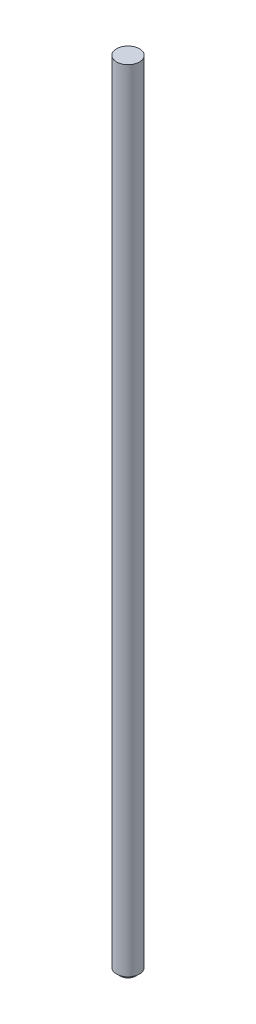
ISO-10303-21;
HEADER;
FILE_DESCRIPTION(('STEP AP214'),'2;1');
FILE_NAME('part.step','',(''),(''),'','','');
FILE_SCHEMA(('AUTOMOTIVE_DESIGN { 1 0 10303 214 1 1 1 1 }'));
ENDSEC;
DATA;
#1=APPLICATION_CONTEXT('core data for automotive mechanical design processes');
#2=APPLICATION_PROTOCOL_DEFINITION('international standard','automotive_design',2000,#1);
#3=PRODUCT_CONTEXT('',#1,'mechanical');
#4=PRODUCT('Part','Part','',(#3));
#5=PRODUCT_RELATED_PRODUCT_CATEGORY('part','',(#4));
#6=PRODUCT_DEFINITION_FORMATION('','',#4);
#7=PRODUCT_DEFINITION_CONTEXT('part definition',#1,'design');
#8=PRODUCT_DEFINITION('design','',#6,#7);
#9=PRODUCT_DEFINITION_SHAPE('','',#8);
#10=(LENGTH_UNIT() NAMED_UNIT(*) SI_UNIT(.MILLI.,.METRE.));
#11=(NAMED_UNIT(*) PLANE_ANGLE_UNIT() SI_UNIT($,.RADIAN.));
#12=(NAMED_UNIT(*) SI_UNIT($,.STERADIAN.) SOLID_ANGLE_UNIT());
#13=UNCERTAINTY_MEASURE_WITH_UNIT(LENGTH_MEASURE(1.E-05),#10,'distance_accuracy_value','');
#14=(GEOMETRIC_REPRESENTATION_CONTEXT(3) GLOBAL_UNCERTAINTY_ASSIGNED_CONTEXT((#13)) GLOBAL_UNIT_ASSIGNED_CONTEXT((#10,
#11,#12)) REPRESENTATION_CONTEXT('',''));
#15=CARTESIAN_POINT('',(0.,0.,0.));
#16=DIRECTION('',(0.,0.,1.));
#17=DIRECTION('',(1.,0.,0.));
#18=AXIS2_PLACEMENT_3D('',#15,#16,#17);
#19=CARTESIAN_POINT('',(0.,400.,0.));
#20=DIRECTION('',(0.,1.,0.));
#21=DIRECTION('',(0.,0.,1.));
#22=AXIS2_PLACEMENT_3D('',#19,#20,#21);
#23=PLANE('',#22);
#24=CARTESIAN_POINT('',(0.,400.,0.));
#25=DIRECTION('',(0.,-1.,0.));
#26=DIRECTION('',(0.,0.,-1.));
#27=AXIS2_PLACEMENT_3D('',#24,#25,#26);
#28=CIRCLE('',#27,5.775);
#29=CARTESIAN_POINT('',(0.,400.,-5.775));
#30=VERTEX_POINT('',#29);
#31=EDGE_CURVE('E10',#30,#30,#28,.T.);
#32=ORIENTED_EDGE('',*,*,#31,.F.);
#33=EDGE_LOOP('',(#32));
#34=FACE_BOUND('',#33,.T.);
#35=ADVANCED_FACE('F31',(#34),#23,.T.);
#36=CARTESIAN_POINT('',(0.,0.,0.));
#37=DIRECTION('',(0.,-1.,0.));
#38=DIRECTION('',(0.,0.,-1.));
#39=AXIS2_PLACEMENT_3D('',#36,#37,#38);
#40=CYLINDRICAL_SURFACE('',#39,5.775);
#41=ORIENTED_EDGE('',*,*,#31,.T.);
#42=EDGE_LOOP('',(#41));
#43=FACE_BOUND('',#42,.T.);
#44=CARTESIAN_POINT('',(0.,1.75197714309117,0.));
#45=DIRECTION('',(0.,-1.,0.));
#46=DIRECTION('',(0.,0.,-1.));
#47=AXIS2_PLACEMENT_3D('',#44,#45,#46);
#48=CIRCLE('',#47,5.775);
#49=CARTESIAN_POINT('',(0.,1.75197714309117,-5.775));
#50=VERTEX_POINT('',#49);
#51=EDGE_CURVE('E37',#50,#50,#48,.T.);
#52=ORIENTED_EDGE('',*,*,#51,.F.);
#53=EDGE_LOOP('',(#52));
#54=FACE_BOUND('',#53,.T.);
#55=ADVANCED_FACE('F63',(#43,#54),#40,.T.);
#56=CARTESIAN_POINT('',(5.775,1.75197714309117,0.));
#57=DIRECTION('',(0.,-1.,0.));
#58=DIRECTION('',(0.,0.,-1.));
#59=AXIS2_PLACEMENT_3D('',#56,#57,#58);
#60=PLANE('',#59);
#61=ORIENTED_EDGE('',*,*,#51,.T.);
#62=EDGE_LOOP('',(#61));
#63=FACE_BOUND('',#62,.T.);
#64=CARTESIAN_POINT('',(0.,1.75197714309117,0.));
#65=DIRECTION('',(0.,-1.,0.));
#66=DIRECTION('',(0.,0.,-1.));
#67=AXIS2_PLACEMENT_3D('',#64,#65,#66);
#68=CIRCLE('',#67,4.);
#69=CARTESIAN_POINT('',(0.,1.75197714309117,-4.));
#70=VERTEX_POINT('',#69);
#71=EDGE_CURVE('E41',#70,#70,#68,.T.);
#72=ORIENTED_EDGE('',*,*,#71,.F.);
#73=EDGE_LOOP('',(#72));
#74=FACE_BOUND('',#73,.T.);
#75=ADVANCED_FACE('F55',(#63,#74),#60,.T.);
#76=CARTESIAN_POINT('',(0.,0.,0.));
#77=DIRECTION('',(0.,-1.,0.));
#78=DIRECTION('',(0.,0.,-1.));
#79=AXIS2_PLACEMENT_3D('',#76,#77,#78);
#80=CYLINDRICAL_SURFACE('',#79,4.);
#81=ORIENTED_EDGE('',*,*,#71,.T.);
#82=EDGE_LOOP('',(#81));
#83=FACE_BOUND('',#82,.T.);
#84=CARTESIAN_POINT('',(0.,0.,0.));
#85=DIRECTION('',(0.,-1.,0.));
#86=DIRECTION('',(0.,0.,-1.));
#87=AXIS2_PLACEMENT_3D('',#84,#85,#86);
#88=CIRCLE('',#87,4.);
#89=CARTESIAN_POINT('',(0.,0.,-4.));
#90=VERTEX_POINT('',#89);
#91=EDGE_CURVE('E45',#90,#90,#88,.T.);
#92=ORIENTED_EDGE('',*,*,#91,.F.);
#93=EDGE_LOOP('',(#92));
#94=FACE_BOUND('',#93,.T.);
#95=ADVANCED_FACE('F53',(#83,#94),#80,.T.);
#96=CARTESIAN_POINT('',(0.,0.,0.));
#97=DIRECTION('',(0.,-1.,0.));
#98=DIRECTION('',(0.,0.,-1.));
#99=AXIS2_PLACEMENT_3D('',#96,#97,#98);
#100=PLANE('',#99);
#101=ORIENTED_EDGE('',*,*,#91,.T.);
#102=EDGE_LOOP('',(#101));
#103=FACE_BOUND('',#102,.T.);
#104=ADVANCED_FACE('F51',(#103),#100,.T.);
#105=CLOSED_SHELL('',(#35,#55,#75,#95,#104));
#106=MANIFOLD_SOLID_BREP('B2',#105);
#107=ADVANCED_BREP_SHAPE_REPRESENTATION('',(#18,#106),#14);
#108=SHAPE_DEFINITION_REPRESENTATION(#9,#107);
ENDSEC;
END-ISO-10303-21;
